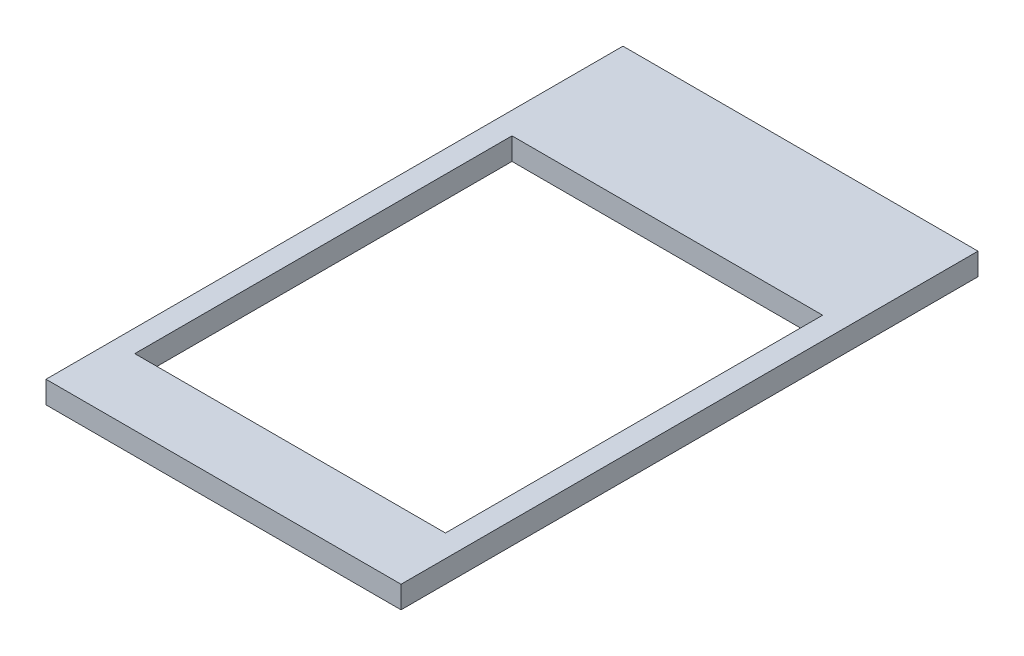
ISO-10303-21;
HEADER;
FILE_DESCRIPTION(('STEP AP214'),'2;1');
FILE_NAME('part.step','',(''),(''),'','','');
FILE_SCHEMA(('AUTOMOTIVE_DESIGN { 1 0 10303 214 1 1 1 1 }'));
ENDSEC;
DATA;
#1=APPLICATION_CONTEXT('core data for automotive mechanical design processes');
#2=APPLICATION_PROTOCOL_DEFINITION('international standard','automotive_design',2000,#1);
#3=PRODUCT_CONTEXT('',#1,'mechanical');
#4=PRODUCT('Part','Part','',(#3));
#5=PRODUCT_RELATED_PRODUCT_CATEGORY('part','',(#4));
#6=PRODUCT_DEFINITION_FORMATION('','',#4);
#7=PRODUCT_DEFINITION_CONTEXT('part definition',#1,'design');
#8=PRODUCT_DEFINITION('design','',#6,#7);
#9=PRODUCT_DEFINITION_SHAPE('','',#8);
#10=(LENGTH_UNIT() NAMED_UNIT(*) SI_UNIT(.MILLI.,.METRE.));
#11=(NAMED_UNIT(*) PLANE_ANGLE_UNIT() SI_UNIT($,.RADIAN.));
#12=(NAMED_UNIT(*) SI_UNIT($,.STERADIAN.) SOLID_ANGLE_UNIT());
#13=UNCERTAINTY_MEASURE_WITH_UNIT(LENGTH_MEASURE(1.E-05),#10,'distance_accuracy_value','');
#14=(GEOMETRIC_REPRESENTATION_CONTEXT(3) GLOBAL_UNCERTAINTY_ASSIGNED_CONTEXT((#13)) GLOBAL_UNIT_ASSIGNED_CONTEXT((#10,
#11,#12)) REPRESENTATION_CONTEXT('',''));
#15=CARTESIAN_POINT('',(0.,0.,0.));
#16=DIRECTION('',(0.,0.,1.));
#17=DIRECTION('',(1.,0.,0.));
#18=AXIS2_PLACEMENT_3D('',#15,#16,#17);
#19=CARTESIAN_POINT('',(0.,6.,0.));
#20=DIRECTION('',(0.,1.,0.));
#21=DIRECTION('',(0.,0.,1.));
#22=AXIS2_PLACEMENT_3D('',#19,#20,#21);
#23=PLANE('',#22);
#24=DIRECTION('',(0.,0.,1.));
#25=VECTOR('',#24,1.);
#26=CARTESIAN_POINT('',(-8.,6.,13.));
#27=LINE('',#26,#25);
#28=CARTESIAN_POINT('',(-8.,6.,-13.));
#29=VERTEX_POINT('',#28);
#30=CARTESIAN_POINT('',(-8.,6.,13.));
#31=VERTEX_POINT('',#30);
#32=EDGE_CURVE('E135',#29,#31,#27,.T.);
#33=ORIENTED_EDGE('',*,*,#32,.T.);
#34=DIRECTION('',(1.,0.,0.));
#35=VECTOR('',#34,1.);
#36=CARTESIAN_POINT('',(8.,6.,13.));
#37=LINE('',#36,#35);
#38=CARTESIAN_POINT('',(8.,6.,13.));
#39=VERTEX_POINT('',#38);
#40=EDGE_CURVE('E138',#31,#39,#37,.T.);
#41=ORIENTED_EDGE('',*,*,#40,.T.);
#42=DIRECTION('',(0.,0.,-1.));
#43=VECTOR('',#42,1.);
#44=CARTESIAN_POINT('',(8.,6.,13.));
#45=LINE('',#44,#43);
#46=CARTESIAN_POINT('',(8.,6.,-13.));
#47=VERTEX_POINT('',#46);
#48=EDGE_CURVE('E141',#39,#47,#45,.T.);
#49=ORIENTED_EDGE('',*,*,#48,.T.);
#50=DIRECTION('',(-1.,0.,0.));
#51=VECTOR('',#50,1.);
#52=CARTESIAN_POINT('',(8.,6.,-13.));
#53=LINE('',#52,#51);
#54=EDGE_CURVE('E143',#47,#29,#53,.T.);
#55=ORIENTED_EDGE('',*,*,#54,.T.);
#56=EDGE_LOOP('',(#33,#41,#49,#55));
#57=FACE_BOUND('',#56,.T.);
#58=DIRECTION('',(1.,0.,0.));
#59=VECTOR('',#58,1.);
#60=CARTESIAN_POINT('',(0.,6.,-6.99999999999999));
#61=LINE('',#60,#59);
#62=CARTESIAN_POINT('',(-7.,6.,-6.99999999999999));
#63=VERTEX_POINT('',#62);
#64=CARTESIAN_POINT('',(7.,6.,-6.99999999999999));
#65=VERTEX_POINT('',#64);
#66=EDGE_CURVE('E107',#63,#65,#61,.T.);
#67=ORIENTED_EDGE('',*,*,#66,.T.);
#68=DIRECTION('',(0.,0.,1.));
#69=VECTOR('',#68,1.);
#70=CARTESIAN_POINT('',(7.,6.,0.));
#71=LINE('',#70,#69);
#72=CARTESIAN_POINT('',(7.,6.,10.));
#73=VERTEX_POINT('',#72);
#74=EDGE_CURVE('E48',#65,#73,#71,.T.);
#75=ORIENTED_EDGE('',*,*,#74,.T.);
#76=DIRECTION('',(-1.,0.,0.));
#77=VECTOR('',#76,1.);
#78=CARTESIAN_POINT('',(0.,6.,10.));
#79=LINE('',#78,#77);
#80=CARTESIAN_POINT('',(-7.,6.,10.));
#81=VERTEX_POINT('',#80);
#82=EDGE_CURVE('E113',#73,#81,#79,.T.);
#83=ORIENTED_EDGE('',*,*,#82,.T.);
#84=DIRECTION('',(0.,0.,-1.));
#85=VECTOR('',#84,1.);
#86=CARTESIAN_POINT('',(-7.,6.,0.));
#87=LINE('',#86,#85);
#88=EDGE_CURVE('E127',#81,#63,#87,.T.);
#89=ORIENTED_EDGE('',*,*,#88,.T.);
#90=EDGE_LOOP('',(#67,#75,#83,#89));
#91=FACE_BOUND('',#90,.T.);
#92=ADVANCED_FACE('F33',(#57,#91),#23,.T.);
#93=CARTESIAN_POINT('',(0.,5.,0.));
#94=DIRECTION('',(0.,1.,0.));
#95=DIRECTION('',(0.,0.,1.));
#96=AXIS2_PLACEMENT_3D('',#93,#94,#95);
#97=PLANE('',#96);
#98=DIRECTION('',(0.,0.,1.));
#99=VECTOR('',#98,1.);
#100=CARTESIAN_POINT('',(-8.,5.,13.));
#101=LINE('',#100,#99);
#102=CARTESIAN_POINT('',(-8.,5.,-13.));
#103=VERTEX_POINT('',#102);
#104=CARTESIAN_POINT('',(-8.,5.,13.));
#105=VERTEX_POINT('',#104);
#106=EDGE_CURVE('E114',#103,#105,#101,.T.);
#107=ORIENTED_EDGE('',*,*,#106,.F.);
#108=DIRECTION('',(-1.,0.,0.));
#109=VECTOR('',#108,1.);
#110=CARTESIAN_POINT('',(8.,5.,-13.));
#111=LINE('',#110,#109);
#112=CARTESIAN_POINT('',(8.,5.,-13.));
#113=VERTEX_POINT('',#112);
#114=EDGE_CURVE('E139',#113,#103,#111,.T.);
#115=ORIENTED_EDGE('',*,*,#114,.F.);
#116=DIRECTION('',(0.,0.,-1.));
#117=VECTOR('',#116,1.);
#118=CARTESIAN_POINT('',(8.,5.,13.));
#119=LINE('',#118,#117);
#120=CARTESIAN_POINT('',(8.,5.,13.));
#121=VERTEX_POINT('',#120);
#122=EDGE_CURVE('E150',#121,#113,#119,.T.);
#123=ORIENTED_EDGE('',*,*,#122,.F.);
#124=DIRECTION('',(1.,0.,0.));
#125=VECTOR('',#124,1.);
#126=CARTESIAN_POINT('',(8.,5.,13.));
#127=LINE('',#126,#125);
#128=EDGE_CURVE('E148',#105,#121,#127,.T.);
#129=ORIENTED_EDGE('',*,*,#128,.F.);
#130=EDGE_LOOP('',(#107,#115,#123,#129));
#131=FACE_BOUND('',#130,.T.);
#132=DIRECTION('',(0.,0.,1.));
#133=VECTOR('',#132,1.);
#134=CARTESIAN_POINT('',(7.,5.,0.));
#135=LINE('',#134,#133);
#136=CARTESIAN_POINT('',(7.,5.,-6.99999999999999));
#137=VERTEX_POINT('',#136);
#138=CARTESIAN_POINT('',(7.,5.,10.));
#139=VERTEX_POINT('',#138);
#140=EDGE_CURVE('E98',#137,#139,#135,.T.);
#141=ORIENTED_EDGE('',*,*,#140,.F.);
#142=DIRECTION('',(1.,0.,0.));
#143=VECTOR('',#142,1.);
#144=CARTESIAN_POINT('',(0.,5.,-6.99999999999999));
#145=LINE('',#144,#143);
#146=CARTESIAN_POINT('',(-7.,5.,-6.99999999999999));
#147=VERTEX_POINT('',#146);
#148=EDGE_CURVE('E121',#147,#137,#145,.T.);
#149=ORIENTED_EDGE('',*,*,#148,.F.);
#150=DIRECTION('',(0.,0.,-1.));
#151=VECTOR('',#150,1.);
#152=CARTESIAN_POINT('',(-7.,5.,0.));
#153=LINE('',#152,#151);
#154=CARTESIAN_POINT('',(-7.,5.,10.));
#155=VERTEX_POINT('',#154);
#156=EDGE_CURVE('E119',#155,#147,#153,.T.);
#157=ORIENTED_EDGE('',*,*,#156,.F.);
#158=DIRECTION('',(-1.,0.,0.));
#159=VECTOR('',#158,1.);
#160=CARTESIAN_POINT('',(0.,5.,10.));
#161=LINE('',#160,#159);
#162=EDGE_CURVE('E106',#139,#155,#161,.T.);
#163=ORIENTED_EDGE('',*,*,#162,.F.);
#164=EDGE_LOOP('',(#141,#149,#157,#163));
#165=FACE_BOUND('',#164,.T.);
#166=ADVANCED_FACE('F118',(#131,#165),#97,.F.);
#167=CARTESIAN_POINT('',(-8.,6.,13.));
#168=DIRECTION('',(1.,0.,0.));
#169=DIRECTION('',(0.,0.,-1.));
#170=AXIS2_PLACEMENT_3D('',#167,#168,#169);
#171=PLANE('',#170);
#172=ORIENTED_EDGE('',*,*,#106,.T.);
#173=DIRECTION('',(0.,-1.,0.));
#174=VECTOR('',#173,1.);
#175=CARTESIAN_POINT('',(-8.,6.,13.));
#176=LINE('',#175,#174);
#177=EDGE_CURVE('E11',#31,#105,#176,.T.);
#178=ORIENTED_EDGE('',*,*,#177,.F.);
#179=ORIENTED_EDGE('',*,*,#32,.F.);
#180=DIRECTION('',(0.,-1.,0.));
#181=VECTOR('',#180,1.);
#182=CARTESIAN_POINT('',(-8.,6.,-13.));
#183=LINE('',#182,#181);
#184=EDGE_CURVE('E145',#29,#103,#183,.T.);
#185=ORIENTED_EDGE('',*,*,#184,.T.);
#186=EDGE_LOOP('',(#172,#178,#179,#185));
#187=FACE_BOUND('',#186,.T.);
#188=ADVANCED_FACE('F35',(#187),#171,.F.);
#189=CARTESIAN_POINT('',(8.,6.,13.));
#190=DIRECTION('',(0.,0.,-1.));
#191=DIRECTION('',(-1.,0.,0.));
#192=AXIS2_PLACEMENT_3D('',#189,#190,#191);
#193=PLANE('',#192);
#194=ORIENTED_EDGE('',*,*,#128,.T.);
#195=DIRECTION('',(0.,-1.,0.));
#196=VECTOR('',#195,1.);
#197=CARTESIAN_POINT('',(8.,6.,13.));
#198=LINE('',#197,#196);
#199=EDGE_CURVE('E41',#39,#121,#198,.T.);
#200=ORIENTED_EDGE('',*,*,#199,.F.);
#201=ORIENTED_EDGE('',*,*,#40,.F.);
#202=ORIENTED_EDGE('',*,*,#177,.T.);
#203=EDGE_LOOP('',(#194,#200,#201,#202));
#204=FACE_BOUND('',#203,.T.);
#205=ADVANCED_FACE('F177',(#204),#193,.F.);
#206=CARTESIAN_POINT('',(8.,6.,13.));
#207=DIRECTION('',(-1.,0.,0.));
#208=DIRECTION('',(0.,0.,1.));
#209=AXIS2_PLACEMENT_3D('',#206,#207,#208);
#210=PLANE('',#209);
#211=ORIENTED_EDGE('',*,*,#122,.T.);
#212=DIRECTION('',(0.,-1.,0.));
#213=VECTOR('',#212,1.);
#214=CARTESIAN_POINT('',(8.,6.,-13.));
#215=LINE('',#214,#213);
#216=EDGE_CURVE('E155',#47,#113,#215,.T.);
#217=ORIENTED_EDGE('',*,*,#216,.F.);
#218=ORIENTED_EDGE('',*,*,#48,.F.);
#219=ORIENTED_EDGE('',*,*,#199,.T.);
#220=EDGE_LOOP('',(#211,#217,#218,#219));
#221=FACE_BOUND('',#220,.T.);
#222=ADVANCED_FACE('F162',(#221),#210,.F.);
#223=CARTESIAN_POINT('',(8.,6.,-13.));
#224=DIRECTION('',(0.,0.,1.));
#225=DIRECTION('',(1.,0.,0.));
#226=AXIS2_PLACEMENT_3D('',#223,#224,#225);
#227=PLANE('',#226);
#228=ORIENTED_EDGE('',*,*,#114,.T.);
#229=ORIENTED_EDGE('',*,*,#184,.F.);
#230=ORIENTED_EDGE('',*,*,#54,.F.);
#231=ORIENTED_EDGE('',*,*,#216,.T.);
#232=EDGE_LOOP('',(#228,#229,#230,#231));
#233=FACE_BOUND('',#232,.T.);
#234=ADVANCED_FACE('F170',(#233),#227,.F.);
#235=CARTESIAN_POINT('',(7.,5.,0.));
#236=DIRECTION('',(-1.,0.,0.));
#237=DIRECTION('',(0.,0.,1.));
#238=AXIS2_PLACEMENT_3D('',#235,#236,#237);
#239=PLANE('',#238);
#240=ORIENTED_EDGE('',*,*,#74,.F.);
#241=DIRECTION('',(0.,1.,0.));
#242=VECTOR('',#241,1.);
#243=CARTESIAN_POINT('',(7.,5.,-6.99999999999999));
#244=LINE('',#243,#242);
#245=EDGE_CURVE('E102',#137,#65,#244,.T.);
#246=ORIENTED_EDGE('',*,*,#245,.F.);
#247=ORIENTED_EDGE('',*,*,#140,.T.);
#248=DIRECTION('',(0.,1.,0.));
#249=VECTOR('',#248,1.);
#250=CARTESIAN_POINT('',(7.,5.,10.));
#251=LINE('',#250,#249);
#252=EDGE_CURVE('E101',#139,#73,#251,.T.);
#253=ORIENTED_EDGE('',*,*,#252,.T.);
#254=EDGE_LOOP('',(#240,#246,#247,#253));
#255=FACE_BOUND('',#254,.T.);
#256=ADVANCED_FACE('F100',(#255),#239,.T.);
#257=CARTESIAN_POINT('',(0.,5.,10.));
#258=DIRECTION('',(0.,0.,-1.));
#259=DIRECTION('',(-1.,0.,0.));
#260=AXIS2_PLACEMENT_3D('',#257,#258,#259);
#261=PLANE('',#260);
#262=ORIENTED_EDGE('',*,*,#82,.F.);
#263=ORIENTED_EDGE('',*,*,#252,.F.);
#264=ORIENTED_EDGE('',*,*,#162,.T.);
#265=DIRECTION('',(0.,1.,0.));
#266=VECTOR('',#265,1.);
#267=CARTESIAN_POINT('',(-7.,5.,10.));
#268=LINE('',#267,#266);
#269=EDGE_CURVE('E115',#155,#81,#268,.T.);
#270=ORIENTED_EDGE('',*,*,#269,.T.);
#271=EDGE_LOOP('',(#262,#263,#264,#270));
#272=FACE_BOUND('',#271,.T.);
#273=ADVANCED_FACE('F110',(#272),#261,.T.);
#274=CARTESIAN_POINT('',(-7.,5.,0.));
#275=DIRECTION('',(1.,0.,0.));
#276=DIRECTION('',(0.,0.,-1.));
#277=AXIS2_PLACEMENT_3D('',#274,#275,#276);
#278=PLANE('',#277);
#279=ORIENTED_EDGE('',*,*,#88,.F.);
#280=ORIENTED_EDGE('',*,*,#269,.F.);
#281=ORIENTED_EDGE('',*,*,#156,.T.);
#282=DIRECTION('',(0.,1.,0.));
#283=VECTOR('',#282,1.);
#284=CARTESIAN_POINT('',(-7.,5.,-6.99999999999999));
#285=LINE('',#284,#283);
#286=EDGE_CURVE('E56',#147,#63,#285,.T.);
#287=ORIENTED_EDGE('',*,*,#286,.T.);
#288=EDGE_LOOP('',(#279,#280,#281,#287));
#289=FACE_BOUND('',#288,.T.);
#290=ADVANCED_FACE('F200',(#289),#278,.T.);
#291=CARTESIAN_POINT('',(0.,5.,-6.99999999999999));
#292=DIRECTION('',(0.,0.,1.));
#293=DIRECTION('',(1.,0.,0.));
#294=AXIS2_PLACEMENT_3D('',#291,#292,#293);
#295=PLANE('',#294);
#296=ORIENTED_EDGE('',*,*,#66,.F.);
#297=ORIENTED_EDGE('',*,*,#286,.F.);
#298=ORIENTED_EDGE('',*,*,#148,.T.);
#299=ORIENTED_EDGE('',*,*,#245,.T.);
#300=EDGE_LOOP('',(#296,#297,#298,#299));
#301=FACE_BOUND('',#300,.T.);
#302=ADVANCED_FACE('F204',(#301),#295,.T.);
#303=CLOSED_SHELL('',(#92,#166,#188,#205,#222,#234,#256,#273,#290,#302));
#304=MANIFOLD_SOLID_BREP('B2',#303);
#305=ADVANCED_BREP_SHAPE_REPRESENTATION('',(#18,#304),#14);
#306=SHAPE_DEFINITION_REPRESENTATION(#9,#305);
ENDSEC;
END-ISO-10303-21;
